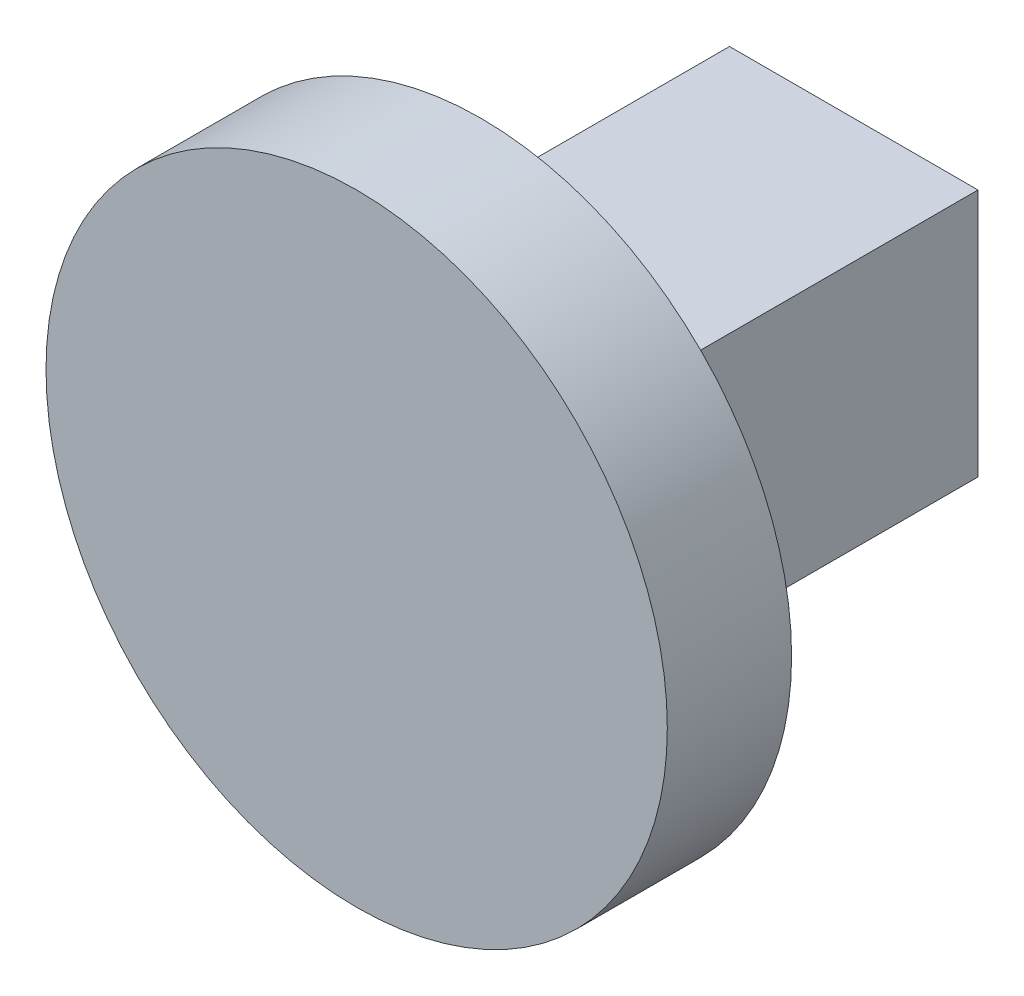
ISO-10303-21;
HEADER;
FILE_DESCRIPTION(('STEP AP214'),'2;1');
FILE_NAME('part.step','',(''),(''),'','','');
FILE_SCHEMA(('AUTOMOTIVE_DESIGN { 1 0 10303 214 1 1 1 1 }'));
ENDSEC;
DATA;
#1=APPLICATION_CONTEXT('core data for automotive mechanical design processes');
#2=APPLICATION_PROTOCOL_DEFINITION('international standard','automotive_design',2000,#1);
#3=PRODUCT_CONTEXT('',#1,'mechanical');
#4=PRODUCT('Part','Part','',(#3));
#5=PRODUCT_RELATED_PRODUCT_CATEGORY('part','',(#4));
#6=PRODUCT_DEFINITION_FORMATION('','',#4);
#7=PRODUCT_DEFINITION_CONTEXT('part definition',#1,'design');
#8=PRODUCT_DEFINITION('design','',#6,#7);
#9=PRODUCT_DEFINITION_SHAPE('','',#8);
#10=(LENGTH_UNIT() NAMED_UNIT(*) SI_UNIT(.MILLI.,.METRE.));
#11=(NAMED_UNIT(*) PLANE_ANGLE_UNIT() SI_UNIT($,.RADIAN.));
#12=(NAMED_UNIT(*) SI_UNIT($,.STERADIAN.) SOLID_ANGLE_UNIT());
#13=UNCERTAINTY_MEASURE_WITH_UNIT(LENGTH_MEASURE(1.E-05),#10,'distance_accuracy_value','');
#14=(GEOMETRIC_REPRESENTATION_CONTEXT(3) GLOBAL_UNCERTAINTY_ASSIGNED_CONTEXT((#13)) GLOBAL_UNIT_ASSIGNED_CONTEXT((#10,
#11,#12)) REPRESENTATION_CONTEXT('',''));
#15=CARTESIAN_POINT('',(0.,0.,0.));
#16=DIRECTION('',(0.,0.,1.));
#17=DIRECTION('',(1.,0.,0.));
#18=AXIS2_PLACEMENT_3D('',#15,#16,#17);
#19=CARTESIAN_POINT('',(5.,-5.,15.));
#20=DIRECTION('',(-1.,0.,0.));
#21=DIRECTION('',(0.,0.,1.));
#22=AXIS2_PLACEMENT_3D('',#19,#20,#21);
#23=PLANE('',#22);
#24=DIRECTION('',(0.,1.,0.));
#25=VECTOR('',#24,1.);
#26=CARTESIAN_POINT('',(5.,-5.,0.));
#27=LINE('',#26,#25);
#28=CARTESIAN_POINT('',(5.,-5.,0.));
#29=VERTEX_POINT('',#28);
#30=CARTESIAN_POINT('',(5.,5.,0.));
#31=VERTEX_POINT('',#30);
#32=EDGE_CURVE('E98',#29,#31,#27,.T.);
#33=ORIENTED_EDGE('',*,*,#32,.T.);
#34=DIRECTION('',(0.,0.,-1.));
#35=VECTOR('',#34,1.);
#36=CARTESIAN_POINT('',(5.,5.,15.));
#37=LINE('',#36,#35);
#38=CARTESIAN_POINT('',(5.,5.,15.));
#39=VERTEX_POINT('',#38);
#40=EDGE_CURVE('E11',#39,#31,#37,.T.);
#41=ORIENTED_EDGE('',*,*,#40,.F.);
#42=DIRECTION('',(0.,1.,0.));
#43=VECTOR('',#42,1.);
#44=CARTESIAN_POINT('',(5.,-5.,15.));
#45=LINE('',#44,#43);
#46=CARTESIAN_POINT('',(5.,-5.,15.));
#47=VERTEX_POINT('',#46);
#48=EDGE_CURVE('E81',#47,#39,#45,.T.);
#49=ORIENTED_EDGE('',*,*,#48,.F.);
#50=DIRECTION('',(0.,0.,-1.));
#51=VECTOR('',#50,1.);
#52=CARTESIAN_POINT('',(5.,-5.,15.));
#53=LINE('',#52,#51);
#54=EDGE_CURVE('E83',#47,#29,#53,.T.);
#55=ORIENTED_EDGE('',*,*,#54,.T.);
#56=EDGE_LOOP('',(#33,#41,#49,#55));
#57=FACE_BOUND('',#56,.T.);
#58=ADVANCED_FACE('F33',(#57),#23,.F.);
#59=CARTESIAN_POINT('',(-5.,5.,15.));
#60=DIRECTION('',(0.,-1.,0.));
#61=DIRECTION('',(0.,0.,-1.));
#62=AXIS2_PLACEMENT_3D('',#59,#60,#61);
#63=PLANE('',#62);
#64=DIRECTION('',(-1.,0.,0.));
#65=VECTOR('',#64,1.);
#66=CARTESIAN_POINT('',(-5.,5.,0.));
#67=LINE('',#66,#65);
#68=CARTESIAN_POINT('',(-5.,5.,0.));
#69=VERTEX_POINT('',#68);
#70=EDGE_CURVE('E100',#31,#69,#67,.T.);
#71=ORIENTED_EDGE('',*,*,#70,.T.);
#72=DIRECTION('',(0.,0.,-1.));
#73=VECTOR('',#72,1.);
#74=CARTESIAN_POINT('',(-5.,5.,15.));
#75=LINE('',#74,#73);
#76=CARTESIAN_POINT('',(-5.,5.,15.));
#77=VERTEX_POINT('',#76);
#78=EDGE_CURVE('E41',#77,#69,#75,.T.);
#79=ORIENTED_EDGE('',*,*,#78,.F.);
#80=DIRECTION('',(-1.,0.,0.));
#81=VECTOR('',#80,1.);
#82=CARTESIAN_POINT('',(-5.,5.,15.));
#83=LINE('',#82,#81);
#84=EDGE_CURVE('E75',#39,#77,#83,.T.);
#85=ORIENTED_EDGE('',*,*,#84,.F.);
#86=ORIENTED_EDGE('',*,*,#40,.T.);
#87=EDGE_LOOP('',(#71,#79,#85,#86));
#88=FACE_BOUND('',#87,.T.);
#89=ADVANCED_FACE('F108',(#88),#63,.F.);
#90=CARTESIAN_POINT('',(-5.,-5.,15.));
#91=DIRECTION('',(1.,0.,0.));
#92=DIRECTION('',(0.,0.,-1.));
#93=AXIS2_PLACEMENT_3D('',#90,#91,#92);
#94=PLANE('',#93);
#95=DIRECTION('',(0.,-1.,0.));
#96=VECTOR('',#95,1.);
#97=CARTESIAN_POINT('',(-5.,-5.,0.));
#98=LINE('',#97,#96);
#99=CARTESIAN_POINT('',(-5.,-5.,0.));
#100=VERTEX_POINT('',#99);
#101=EDGE_CURVE('E65',#69,#100,#98,.T.);
#102=ORIENTED_EDGE('',*,*,#101,.T.);
#103=DIRECTION('',(0.,0.,-1.));
#104=VECTOR('',#103,1.);
#105=CARTESIAN_POINT('',(-5.,-5.,15.));
#106=LINE('',#105,#104);
#107=CARTESIAN_POINT('',(-5.,-5.,15.));
#108=VERTEX_POINT('',#107);
#109=EDGE_CURVE('E49',#108,#100,#106,.T.);
#110=ORIENTED_EDGE('',*,*,#109,.F.);
#111=DIRECTION('',(0.,-1.,0.));
#112=VECTOR('',#111,1.);
#113=CARTESIAN_POINT('',(-5.,-5.,15.));
#114=LINE('',#113,#112);
#115=EDGE_CURVE('E93',#77,#108,#114,.T.);
#116=ORIENTED_EDGE('',*,*,#115,.F.);
#117=ORIENTED_EDGE('',*,*,#78,.T.);
#118=EDGE_LOOP('',(#102,#110,#116,#117));
#119=FACE_BOUND('',#118,.T.);
#120=ADVANCED_FACE('F105',(#119),#94,.F.);
#121=CARTESIAN_POINT('',(-5.,-5.,15.));
#122=DIRECTION('',(0.,1.,0.));
#123=DIRECTION('',(0.,0.,1.));
#124=AXIS2_PLACEMENT_3D('',#121,#122,#123);
#125=PLANE('',#124);
#126=DIRECTION('',(1.,0.,0.));
#127=VECTOR('',#126,1.);
#128=CARTESIAN_POINT('',(-5.,-5.,0.));
#129=LINE('',#128,#127);
#130=EDGE_CURVE('E70',#100,#29,#129,.T.);
#131=ORIENTED_EDGE('',*,*,#130,.T.);
#132=ORIENTED_EDGE('',*,*,#54,.F.);
#133=DIRECTION('',(1.,0.,0.));
#134=VECTOR('',#133,1.);
#135=CARTESIAN_POINT('',(-5.,-5.,15.));
#136=LINE('',#135,#134);
#137=EDGE_CURVE('E89',#108,#47,#136,.T.);
#138=ORIENTED_EDGE('',*,*,#137,.F.);
#139=ORIENTED_EDGE('',*,*,#109,.T.);
#140=EDGE_LOOP('',(#131,#132,#138,#139));
#141=FACE_BOUND('',#140,.T.);
#142=ADVANCED_FACE('F88',(#141),#125,.F.);
#143=CARTESIAN_POINT('',(0.,0.,0.));
#144=DIRECTION('',(0.,0.,-1.));
#145=DIRECTION('',(-1.,0.,0.));
#146=AXIS2_PLACEMENT_3D('',#143,#144,#145);
#147=PLANE('',#146);
#148=ORIENTED_EDGE('',*,*,#32,.F.);
#149=ORIENTED_EDGE('',*,*,#130,.F.);
#150=ORIENTED_EDGE('',*,*,#101,.F.);
#151=ORIENTED_EDGE('',*,*,#70,.F.);
#152=EDGE_LOOP('',(#148,#149,#150,#151));
#153=FACE_BOUND('',#152,.T.);
#154=ADVANCED_FACE('F107',(#153),#147,.T.);
#155=CARTESIAN_POINT('',(0.,0.,15.));
#156=DIRECTION('',(0.,0.,1.));
#157=DIRECTION('',(1.,0.,0.));
#158=AXIS2_PLACEMENT_3D('',#155,#156,#157);
#159=PLANE('',#158);
#160=CARTESIAN_POINT('',(0.,0.,15.));
#161=DIRECTION('',(0.,0.,1.));
#162=DIRECTION('',(1.,0.,0.));
#163=AXIS2_PLACEMENT_3D('',#160,#161,#162);
#164=CIRCLE('',#163,12.5);
#165=CARTESIAN_POINT('',(12.5,0.,15.));
#166=VERTEX_POINT('',#165);
#167=EDGE_CURVE('E134',#166,#166,#164,.T.);
#168=ORIENTED_EDGE('',*,*,#167,.F.);
#169=EDGE_LOOP('',(#168));
#170=FACE_BOUND('',#169,.T.);
#171=ORIENTED_EDGE('',*,*,#137,.T.);
#172=ORIENTED_EDGE('',*,*,#48,.T.);
#173=ORIENTED_EDGE('',*,*,#84,.T.);
#174=ORIENTED_EDGE('',*,*,#115,.T.);
#175=EDGE_LOOP('',(#171,#172,#173,#174));
#176=FACE_BOUND('',#175,.T.);
#177=ADVANCED_FACE('F92',(#170,#176),#159,.F.);
#178=CARTESIAN_POINT('',(0.,0.,20.));
#179=DIRECTION('',(0.,0.,-1.));
#180=DIRECTION('',(-1.,0.,0.));
#181=AXIS2_PLACEMENT_3D('',#178,#179,#180);
#182=CYLINDRICAL_SURFACE('',#181,12.5);
#183=CARTESIAN_POINT('',(0.,0.,20.));
#184=DIRECTION('',(0.,0.,1.));
#185=DIRECTION('',(1.,0.,0.));
#186=AXIS2_PLACEMENT_3D('',#183,#184,#185);
#187=CIRCLE('',#186,12.5);
#188=CARTESIAN_POINT('',(12.5,0.,20.));
#189=VERTEX_POINT('',#188);
#190=EDGE_CURVE('E101',#189,#189,#187,.T.);
#191=ORIENTED_EDGE('',*,*,#190,.F.);
#192=EDGE_LOOP('',(#191));
#193=FACE_BOUND('',#192,.T.);
#194=ORIENTED_EDGE('',*,*,#167,.T.);
#195=EDGE_LOOP('',(#194));
#196=FACE_BOUND('',#195,.T.);
#197=ADVANCED_FACE('F120',(#193,#196),#182,.T.);
#198=CARTESIAN_POINT('',(0.,0.,20.));
#199=DIRECTION('',(0.,0.,1.));
#200=DIRECTION('',(1.,0.,0.));
#201=AXIS2_PLACEMENT_3D('',#198,#199,#200);
#202=PLANE('',#201);
#203=ORIENTED_EDGE('',*,*,#190,.T.);
#204=EDGE_LOOP('',(#203));
#205=FACE_BOUND('',#204,.T.);
#206=ADVANCED_FACE('F123',(#205),#202,.T.);
#207=CLOSED_SHELL('',(#58,#89,#120,#142,#154,#177,#197,#206));
#208=MANIFOLD_SOLID_BREP('B2',#207);
#209=ADVANCED_BREP_SHAPE_REPRESENTATION('',(#18,#208),#14);
#210=SHAPE_DEFINITION_REPRESENTATION(#9,#209);
ENDSEC;
END-ISO-10303-21;
